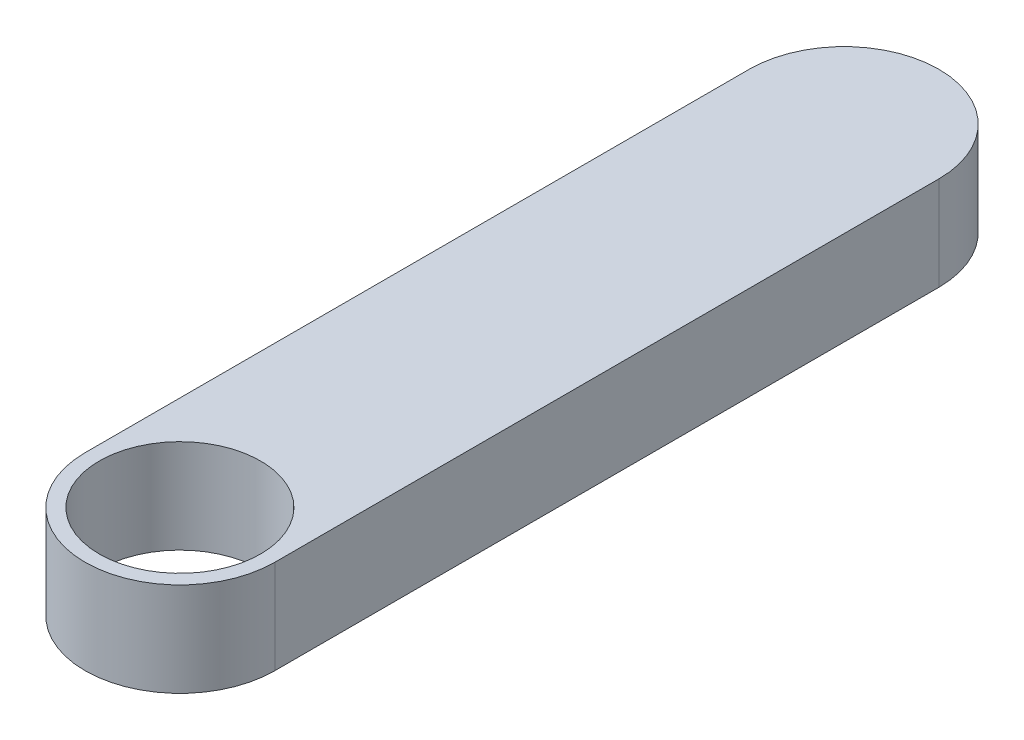
ISO-10303-21;
HEADER;
FILE_DESCRIPTION(('STEP AP214'),'2;1');
FILE_NAME('part.step','',(''),(''),'','','');
FILE_SCHEMA(('AUTOMOTIVE_DESIGN { 1 0 10303 214 1 1 1 1 }'));
ENDSEC;
DATA;
#1=APPLICATION_CONTEXT('core data for automotive mechanical design processes');
#2=APPLICATION_PROTOCOL_DEFINITION('international standard','automotive_design',2000,#1);
#3=PRODUCT_CONTEXT('',#1,'mechanical');
#4=PRODUCT('Part','Part','',(#3));
#5=PRODUCT_RELATED_PRODUCT_CATEGORY('part','',(#4));
#6=PRODUCT_DEFINITION_FORMATION('','',#4);
#7=PRODUCT_DEFINITION_CONTEXT('part definition',#1,'design');
#8=PRODUCT_DEFINITION('design','',#6,#7);
#9=PRODUCT_DEFINITION_SHAPE('','',#8);
#10=(LENGTH_UNIT() NAMED_UNIT(*) SI_UNIT(.MILLI.,.METRE.));
#11=(NAMED_UNIT(*) PLANE_ANGLE_UNIT() SI_UNIT($,.RADIAN.));
#12=(NAMED_UNIT(*) SI_UNIT($,.STERADIAN.) SOLID_ANGLE_UNIT());
#13=UNCERTAINTY_MEASURE_WITH_UNIT(LENGTH_MEASURE(1.E-05),#10,'distance_accuracy_value','');
#14=(GEOMETRIC_REPRESENTATION_CONTEXT(3) GLOBAL_UNCERTAINTY_ASSIGNED_CONTEXT((#13)) GLOBAL_UNIT_ASSIGNED_CONTEXT((#10,
#11,#12)) REPRESENTATION_CONTEXT('',''));
#15=CARTESIAN_POINT('',(0.,0.,0.));
#16=DIRECTION('',(0.,0.,1.));
#17=DIRECTION('',(1.,0.,0.));
#18=AXIS2_PLACEMENT_3D('',#15,#16,#17);
#19=CARTESIAN_POINT('',(0.,99.,0.));
#20=DIRECTION('',(0.,-1.,0.));
#21=DIRECTION('',(0.,0.,-1.));
#22=AXIS2_PLACEMENT_3D('',#19,#20,#21);
#23=CYLINDRICAL_SURFACE('',#22,100.);
#24=CARTESIAN_POINT('',(0.,0.,0.));
#25=DIRECTION('',(0.,1.,0.));
#26=DIRECTION('',(0.,0.,1.));
#27=AXIS2_PLACEMENT_3D('',#24,#25,#26);
#28=CIRCLE('',#27,100.);
#29=CARTESIAN_POINT('',(-100.,0.,0.));
#30=VERTEX_POINT('',#29);
#31=CARTESIAN_POINT('',(100.,0.,0.));
#32=VERTEX_POINT('',#31);
#33=EDGE_CURVE('E113',#30,#32,#28,.T.);
#34=ORIENTED_EDGE('',*,*,#33,.T.);
#35=DIRECTION('',(0.,-1.,0.));
#36=VECTOR('',#35,1.);
#37=CARTESIAN_POINT('',(100.,99.,0.));
#38=LINE('',#37,#36);
#39=CARTESIAN_POINT('',(100.,99.,0.));
#40=VERTEX_POINT('',#39);
#41=EDGE_CURVE('E11',#40,#32,#38,.T.);
#42=ORIENTED_EDGE('',*,*,#41,.F.);
#43=CARTESIAN_POINT('',(0.,99.,0.));
#44=DIRECTION('',(0.,1.,0.));
#45=DIRECTION('',(0.,0.,1.));
#46=AXIS2_PLACEMENT_3D('',#43,#44,#45);
#47=CIRCLE('',#46,100.);
#48=CARTESIAN_POINT('',(-100.,99.,0.));
#49=VERTEX_POINT('',#48);
#50=EDGE_CURVE('E95',#49,#40,#47,.T.);
#51=ORIENTED_EDGE('',*,*,#50,.F.);
#52=DIRECTION('',(0.,-1.,0.));
#53=VECTOR('',#52,1.);
#54=CARTESIAN_POINT('',(-100.,99.,0.));
#55=LINE('',#54,#53);
#56=EDGE_CURVE('E62',#49,#30,#55,.T.);
#57=ORIENTED_EDGE('',*,*,#56,.T.);
#58=EDGE_LOOP('',(#34,#42,#51,#57));
#59=FACE_BOUND('',#58,.T.);
#60=ADVANCED_FACE('F45',(#59),#23,.T.);
#61=CARTESIAN_POINT('',(100.,99.,0.));
#62=DIRECTION('',(-1.,0.,0.));
#63=DIRECTION('',(0.,0.,1.));
#64=AXIS2_PLACEMENT_3D('',#61,#62,#63);
#65=PLANE('',#64);
#66=DIRECTION('',(0.,0.,-1.));
#67=VECTOR('',#66,1.);
#68=CARTESIAN_POINT('',(100.,0.,0.));
#69=LINE('',#68,#67);
#70=CARTESIAN_POINT('',(100.,0.,-700.));
#71=VERTEX_POINT('',#70);
#72=EDGE_CURVE('E101',#32,#71,#69,.T.);
#73=ORIENTED_EDGE('',*,*,#72,.T.);
#74=DIRECTION('',(0.,-1.,0.));
#75=VECTOR('',#74,1.);
#76=CARTESIAN_POINT('',(100.,99.,-700.));
#77=LINE('',#76,#75);
#78=CARTESIAN_POINT('',(100.,99.,-700.));
#79=VERTEX_POINT('',#78);
#80=EDGE_CURVE('E54',#79,#71,#77,.T.);
#81=ORIENTED_EDGE('',*,*,#80,.F.);
#82=DIRECTION('',(0.,0.,-1.));
#83=VECTOR('',#82,1.);
#84=CARTESIAN_POINT('',(100.,99.,0.));
#85=LINE('',#84,#83);
#86=EDGE_CURVE('E88',#40,#79,#85,.T.);
#87=ORIENTED_EDGE('',*,*,#86,.F.);
#88=ORIENTED_EDGE('',*,*,#41,.T.);
#89=EDGE_LOOP('',(#73,#81,#87,#88));
#90=FACE_BOUND('',#89,.T.);
#91=ADVANCED_FACE('F100',(#90),#65,.F.);
#92=CARTESIAN_POINT('',(0.,99.,-700.));
#93=DIRECTION('',(0.,-1.,0.));
#94=DIRECTION('',(0.,0.,-1.));
#95=AXIS2_PLACEMENT_3D('',#92,#93,#94);
#96=CYLINDRICAL_SURFACE('',#95,100.);
#97=CARTESIAN_POINT('',(0.,0.,-700.));
#98=DIRECTION('',(0.,1.,0.));
#99=DIRECTION('',(0.,0.,1.));
#100=AXIS2_PLACEMENT_3D('',#97,#98,#99);
#101=CIRCLE('',#100,100.);
#102=CARTESIAN_POINT('',(-100.,0.,-700.));
#103=VERTEX_POINT('',#102);
#104=EDGE_CURVE('E119',#71,#103,#101,.T.);
#105=ORIENTED_EDGE('',*,*,#104,.T.);
#106=DIRECTION('',(0.,-1.,0.));
#107=VECTOR('',#106,1.);
#108=CARTESIAN_POINT('',(-100.,99.,-700.));
#109=LINE('',#108,#107);
#110=CARTESIAN_POINT('',(-100.,99.,-700.));
#111=VERTEX_POINT('',#110);
#112=EDGE_CURVE('E77',#111,#103,#109,.T.);
#113=ORIENTED_EDGE('',*,*,#112,.F.);
#114=CARTESIAN_POINT('',(0.,99.,-700.));
#115=DIRECTION('',(0.,1.,0.));
#116=DIRECTION('',(0.,0.,1.));
#117=AXIS2_PLACEMENT_3D('',#114,#115,#116);
#118=CIRCLE('',#117,100.);
#119=EDGE_CURVE('E94',#79,#111,#118,.T.);
#120=ORIENTED_EDGE('',*,*,#119,.F.);
#121=ORIENTED_EDGE('',*,*,#80,.T.);
#122=EDGE_LOOP('',(#105,#113,#120,#121));
#123=FACE_BOUND('',#122,.T.);
#124=ADVANCED_FACE('F105',(#123),#96,.T.);
#125=CARTESIAN_POINT('',(-100.,99.,0.));
#126=DIRECTION('',(-1.,0.,0.));
#127=DIRECTION('',(0.,0.,1.));
#128=AXIS2_PLACEMENT_3D('',#125,#126,#127);
#129=PLANE('',#128);
#130=DIRECTION('',(0.,0.,-1.));
#131=VECTOR('',#130,1.);
#132=CARTESIAN_POINT('',(-100.,0.,0.));
#133=LINE('',#132,#131);
#134=EDGE_CURVE('E122',#30,#103,#133,.T.);
#135=ORIENTED_EDGE('',*,*,#134,.F.);
#136=ORIENTED_EDGE('',*,*,#56,.F.);
#137=DIRECTION('',(0.,0.,-1.));
#138=VECTOR('',#137,1.);
#139=CARTESIAN_POINT('',(-100.,99.,0.));
#140=LINE('',#139,#138);
#141=EDGE_CURVE('E107',#49,#111,#140,.T.);
#142=ORIENTED_EDGE('',*,*,#141,.T.);
#143=ORIENTED_EDGE('',*,*,#112,.T.);
#144=EDGE_LOOP('',(#135,#136,#142,#143));
#145=FACE_BOUND('',#144,.T.);
#146=ADVANCED_FACE('F149',(#145),#129,.T.);
#147=CARTESIAN_POINT('',(0.,99.,0.));
#148=DIRECTION('',(0.,1.,0.));
#149=DIRECTION('',(0.,0.,1.));
#150=AXIS2_PLACEMENT_3D('',#147,#148,#149);
#151=PLANE('',#150);
#152=CARTESIAN_POINT('',(0.,99.,0.));
#153=DIRECTION('',(0.,1.,0.));
#154=DIRECTION('',(0.,0.,1.));
#155=AXIS2_PLACEMENT_3D('',#152,#153,#154);
#156=CIRCLE('',#155,85.);
#157=CARTESIAN_POINT('',(0.,99.,85.));
#158=VERTEX_POINT('',#157);
#159=EDGE_CURVE('E132',#158,#158,#156,.T.);
#160=ORIENTED_EDGE('',*,*,#159,.F.);
#161=EDGE_LOOP('',(#160));
#162=FACE_BOUND('',#161,.T.);
#163=ORIENTED_EDGE('',*,*,#50,.T.);
#164=ORIENTED_EDGE('',*,*,#86,.T.);
#165=ORIENTED_EDGE('',*,*,#119,.T.);
#166=ORIENTED_EDGE('',*,*,#141,.F.);
#167=EDGE_LOOP('',(#163,#164,#165,#166));
#168=FACE_BOUND('',#167,.T.);
#169=ADVANCED_FACE('F91',(#162,#168),#151,.T.);
#170=CARTESIAN_POINT('',(0.,0.,0.));
#171=DIRECTION('',(0.,1.,0.));
#172=DIRECTION('',(0.,0.,1.));
#173=AXIS2_PLACEMENT_3D('',#170,#171,#172);
#174=PLANE('',#173);
#175=CARTESIAN_POINT('',(0.,0.,0.));
#176=DIRECTION('',(0.,1.,0.));
#177=DIRECTION('',(0.,0.,1.));
#178=AXIS2_PLACEMENT_3D('',#175,#176,#177);
#179=CIRCLE('',#178,85.);
#180=CARTESIAN_POINT('',(0.,0.,85.));
#181=VERTEX_POINT('',#180);
#182=EDGE_CURVE('E116',#181,#181,#179,.T.);
#183=ORIENTED_EDGE('',*,*,#182,.T.);
#184=EDGE_LOOP('',(#183));
#185=FACE_BOUND('',#184,.T.);
#186=ORIENTED_EDGE('',*,*,#33,.F.);
#187=ORIENTED_EDGE('',*,*,#134,.T.);
#188=ORIENTED_EDGE('',*,*,#104,.F.);
#189=ORIENTED_EDGE('',*,*,#72,.F.);
#190=EDGE_LOOP('',(#186,#187,#188,#189));
#191=FACE_BOUND('',#190,.T.);
#192=ADVANCED_FACE('F140',(#185,#191),#174,.F.);
#193=CARTESIAN_POINT('',(0.,0.,0.));
#194=DIRECTION('',(0.,1.,0.));
#195=DIRECTION('',(0.,0.,1.));
#196=AXIS2_PLACEMENT_3D('',#193,#194,#195);
#197=CYLINDRICAL_SURFACE('',#196,85.);
#198=ORIENTED_EDGE('',*,*,#182,.F.);
#199=EDGE_LOOP('',(#198));
#200=FACE_BOUND('',#199,.T.);
#201=ORIENTED_EDGE('',*,*,#159,.T.);
#202=EDGE_LOOP('',(#201));
#203=FACE_BOUND('',#202,.T.);
#204=ADVANCED_FACE('F142',(#200,#203),#197,.F.);
#205=CLOSED_SHELL('',(#60,#91,#124,#146,#169,#192,#204));
#206=MANIFOLD_SOLID_BREP('B2',#205);
#207=ADVANCED_BREP_SHAPE_REPRESENTATION('',(#18,#206),#14);
#208=SHAPE_DEFINITION_REPRESENTATION(#9,#207);
ENDSEC;
END-ISO-10303-21;
